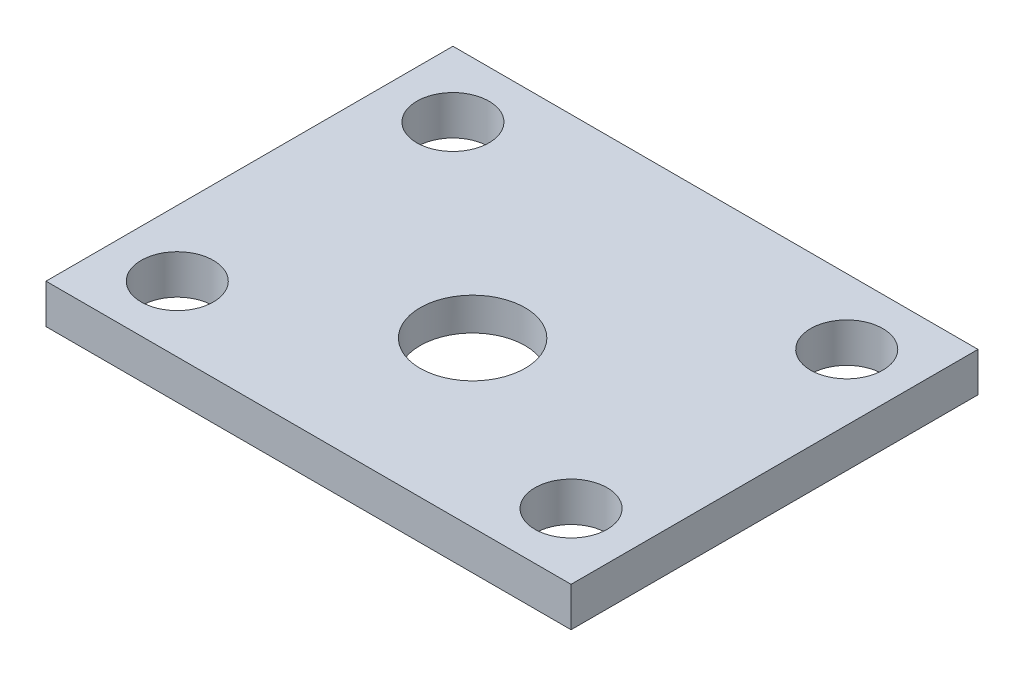
ISO-10303-21;
HEADER;
FILE_DESCRIPTION(('STEP AP214'),'2;1');
FILE_NAME('part.step','',(''),(''),'','','');
FILE_SCHEMA(('AUTOMOTIVE_DESIGN { 1 0 10303 214 1 1 1 1 }'));
ENDSEC;
DATA;
#1=APPLICATION_CONTEXT('core data for automotive mechanical design processes');
#2=APPLICATION_PROTOCOL_DEFINITION('international standard','automotive_design',2000,#1);
#3=PRODUCT_CONTEXT('',#1,'mechanical');
#4=PRODUCT('Part','Part','',(#3));
#5=PRODUCT_RELATED_PRODUCT_CATEGORY('part','',(#4));
#6=PRODUCT_DEFINITION_FORMATION('','',#4);
#7=PRODUCT_DEFINITION_CONTEXT('part definition',#1,'design');
#8=PRODUCT_DEFINITION('design','',#6,#7);
#9=PRODUCT_DEFINITION_SHAPE('','',#8);
#10=(LENGTH_UNIT() NAMED_UNIT(*) SI_UNIT(.MILLI.,.METRE.));
#11=(NAMED_UNIT(*) PLANE_ANGLE_UNIT() SI_UNIT($,.RADIAN.));
#12=(NAMED_UNIT(*) SI_UNIT($,.STERADIAN.) SOLID_ANGLE_UNIT());
#13=UNCERTAINTY_MEASURE_WITH_UNIT(LENGTH_MEASURE(1.E-05),#10,'distance_accuracy_value','');
#14=(GEOMETRIC_REPRESENTATION_CONTEXT(3) GLOBAL_UNCERTAINTY_ASSIGNED_CONTEXT((#13)) GLOBAL_UNIT_ASSIGNED_CONTEXT((#10,
#11,#12)) REPRESENTATION_CONTEXT('',''));
#15=CARTESIAN_POINT('',(0.,0.,0.));
#16=DIRECTION('',(0.,0.,1.));
#17=DIRECTION('',(1.,0.,0.));
#18=AXIS2_PLACEMENT_3D('',#15,#16,#17);
#19=CARTESIAN_POINT('',(20.,3.,15.5));
#20=DIRECTION('',(-1.,0.,0.));
#21=DIRECTION('',(0.,0.,1.));
#22=AXIS2_PLACEMENT_3D('',#19,#20,#21);
#23=PLANE('',#22);
#24=DIRECTION('',(0.,0.,-1.));
#25=VECTOR('',#24,1.);
#26=CARTESIAN_POINT('',(20.,0.,15.5));
#27=LINE('',#26,#25);
#28=CARTESIAN_POINT('',(20.,0.,15.5));
#29=VERTEX_POINT('',#28);
#30=CARTESIAN_POINT('',(20.,0.,-15.5));
#31=VERTEX_POINT('',#30);
#32=EDGE_CURVE('E95',#29,#31,#27,.T.);
#33=ORIENTED_EDGE('',*,*,#32,.T.);
#34=DIRECTION('',(0.,-1.,0.));
#35=VECTOR('',#34,1.);
#36=CARTESIAN_POINT('',(20.,3.,-15.5));
#37=LINE('',#36,#35);
#38=CARTESIAN_POINT('',(20.,3.,-15.5));
#39=VERTEX_POINT('',#38);
#40=EDGE_CURVE('E11',#39,#31,#37,.T.);
#41=ORIENTED_EDGE('',*,*,#40,.F.);
#42=DIRECTION('',(0.,0.,-1.));
#43=VECTOR('',#42,1.);
#44=CARTESIAN_POINT('',(20.,3.,15.5));
#45=LINE('',#44,#43);
#46=CARTESIAN_POINT('',(20.,3.,15.5));
#47=VERTEX_POINT('',#46);
#48=EDGE_CURVE('E83',#47,#39,#45,.T.);
#49=ORIENTED_EDGE('',*,*,#48,.F.);
#50=DIRECTION('',(0.,-1.,0.));
#51=VECTOR('',#50,1.);
#52=CARTESIAN_POINT('',(20.,3.,15.5));
#53=LINE('',#52,#51);
#54=EDGE_CURVE('E91',#47,#29,#53,.T.);
#55=ORIENTED_EDGE('',*,*,#54,.T.);
#56=EDGE_LOOP('',(#33,#41,#49,#55));
#57=FACE_BOUND('',#56,.T.);
#58=ADVANCED_FACE('F32',(#57),#23,.F.);
#59=CARTESIAN_POINT('',(-20.,3.,-15.5));
#60=DIRECTION('',(0.,0.,1.));
#61=DIRECTION('',(1.,0.,0.));
#62=AXIS2_PLACEMENT_3D('',#59,#60,#61);
#63=PLANE('',#62);
#64=DIRECTION('',(-1.,0.,0.));
#65=VECTOR('',#64,1.);
#66=CARTESIAN_POINT('',(-20.,0.,-15.5));
#67=LINE('',#66,#65);
#68=CARTESIAN_POINT('',(-20.,0.,-15.5));
#69=VERTEX_POINT('',#68);
#70=EDGE_CURVE('E87',#31,#69,#67,.T.);
#71=ORIENTED_EDGE('',*,*,#70,.T.);
#72=DIRECTION('',(0.,-1.,0.));
#73=VECTOR('',#72,1.);
#74=CARTESIAN_POINT('',(-20.,3.,-15.5));
#75=LINE('',#74,#73);
#76=CARTESIAN_POINT('',(-20.,3.,-15.5));
#77=VERTEX_POINT('',#76);
#78=EDGE_CURVE('E40',#77,#69,#75,.T.);
#79=ORIENTED_EDGE('',*,*,#78,.F.);
#80=DIRECTION('',(-1.,0.,0.));
#81=VECTOR('',#80,1.);
#82=CARTESIAN_POINT('',(-20.,3.,-15.5));
#83=LINE('',#82,#81);
#84=EDGE_CURVE('E78',#39,#77,#83,.T.);
#85=ORIENTED_EDGE('',*,*,#84,.F.);
#86=ORIENTED_EDGE('',*,*,#40,.T.);
#87=EDGE_LOOP('',(#71,#79,#85,#86));
#88=FACE_BOUND('',#87,.T.);
#89=ADVANCED_FACE('F86',(#88),#63,.F.);
#90=CARTESIAN_POINT('',(-20.,3.,15.5));
#91=DIRECTION('',(1.,0.,0.));
#92=DIRECTION('',(0.,0.,-1.));
#93=AXIS2_PLACEMENT_3D('',#90,#91,#92);
#94=PLANE('',#93);
#95=DIRECTION('',(0.,0.,1.));
#96=VECTOR('',#95,1.);
#97=CARTESIAN_POINT('',(-20.,0.,15.5));
#98=LINE('',#97,#96);
#99=CARTESIAN_POINT('',(-20.,0.,15.5));
#100=VERTEX_POINT('',#99);
#101=EDGE_CURVE('E65',#69,#100,#98,.T.);
#102=ORIENTED_EDGE('',*,*,#101,.T.);
#103=DIRECTION('',(0.,-1.,0.));
#104=VECTOR('',#103,1.);
#105=CARTESIAN_POINT('',(-20.,3.,15.5));
#106=LINE('',#105,#104);
#107=CARTESIAN_POINT('',(-20.,3.,15.5));
#108=VERTEX_POINT('',#107);
#109=EDGE_CURVE('E88',#108,#100,#106,.T.);
#110=ORIENTED_EDGE('',*,*,#109,.F.);
#111=DIRECTION('',(0.,0.,1.));
#112=VECTOR('',#111,1.);
#113=CARTESIAN_POINT('',(-20.,3.,15.5));
#114=LINE('',#113,#112);
#115=EDGE_CURVE('E81',#77,#108,#114,.T.);
#116=ORIENTED_EDGE('',*,*,#115,.F.);
#117=ORIENTED_EDGE('',*,*,#78,.T.);
#118=EDGE_LOOP('',(#102,#110,#116,#117));
#119=FACE_BOUND('',#118,.T.);
#120=ADVANCED_FACE('F89',(#119),#94,.F.);
#121=CARTESIAN_POINT('',(-20.,3.,15.5));
#122=DIRECTION('',(0.,0.,-1.));
#123=DIRECTION('',(-1.,0.,0.));
#124=AXIS2_PLACEMENT_3D('',#121,#122,#123);
#125=PLANE('',#124);
#126=DIRECTION('',(1.,0.,0.));
#127=VECTOR('',#126,1.);
#128=CARTESIAN_POINT('',(-20.,0.,15.5));
#129=LINE('',#128,#127);
#130=EDGE_CURVE('E71',#100,#29,#129,.T.);
#131=ORIENTED_EDGE('',*,*,#130,.T.);
#132=ORIENTED_EDGE('',*,*,#54,.F.);
#133=DIRECTION('',(1.,0.,0.));
#134=VECTOR('',#133,1.);
#135=CARTESIAN_POINT('',(-20.,3.,15.5));
#136=LINE('',#135,#134);
#137=EDGE_CURVE('E48',#108,#47,#136,.T.);
#138=ORIENTED_EDGE('',*,*,#137,.F.);
#139=ORIENTED_EDGE('',*,*,#109,.T.);
#140=EDGE_LOOP('',(#131,#132,#138,#139));
#141=FACE_BOUND('',#140,.T.);
#142=ADVANCED_FACE('F103',(#141),#125,.F.);
#143=CARTESIAN_POINT('',(0.,3.,0.));
#144=DIRECTION('',(0.,-1.,0.));
#145=DIRECTION('',(0.,0.,-1.));
#146=AXIS2_PLACEMENT_3D('',#143,#144,#145);
#147=PLANE('',#146);
#148=CARTESIAN_POINT('',(0.,3.,3.));
#149=DIRECTION('',(0.,1.,0.));
#150=DIRECTION('',(0.,0.,1.));
#151=AXIS2_PLACEMENT_3D('',#148,#149,#150);
#152=CIRCLE('',#151,4.);
#153=CARTESIAN_POINT('',(0.,3.,7.));
#154=VERTEX_POINT('',#153);
#155=EDGE_CURVE('E141',#154,#154,#152,.T.);
#156=ORIENTED_EDGE('',*,*,#155,.F.);
#157=EDGE_LOOP('',(#156));
#158=FACE_BOUND('',#157,.T.);
#159=CARTESIAN_POINT('',(-14.9999999999998,3.,10.5));
#160=DIRECTION('',(0.,1.,0.));
#161=DIRECTION('',(0.,0.,1.));
#162=AXIS2_PLACEMENT_3D('',#159,#160,#161);
#163=CIRCLE('',#162,2.75);
#164=CARTESIAN_POINT('',(-14.9999999999998,3.,13.25));
#165=VERTEX_POINT('',#164);
#166=EDGE_CURVE('E119',#165,#165,#163,.T.);
#167=ORIENTED_EDGE('',*,*,#166,.F.);
#168=EDGE_LOOP('',(#167));
#169=FACE_BOUND('',#168,.T.);
#170=CARTESIAN_POINT('',(15.0000000000002,3.,10.5));
#171=DIRECTION('',(0.,1.,0.));
#172=DIRECTION('',(0.,0.,1.));
#173=AXIS2_PLACEMENT_3D('',#170,#171,#172);
#174=CIRCLE('',#173,2.75);
#175=CARTESIAN_POINT('',(15.0000000000002,3.,13.25));
#176=VERTEX_POINT('',#175);
#177=EDGE_CURVE('E118',#176,#176,#174,.T.);
#178=ORIENTED_EDGE('',*,*,#177,.F.);
#179=EDGE_LOOP('',(#178));
#180=FACE_BOUND('',#179,.T.);
#181=CARTESIAN_POINT('',(15.,3.,-10.5));
#182=DIRECTION('',(0.,1.,0.));
#183=DIRECTION('',(0.,0.,1.));
#184=AXIS2_PLACEMENT_3D('',#181,#182,#183);
#185=CIRCLE('',#184,2.75);
#186=CARTESIAN_POINT('',(15.,3.,-7.75));
#187=VERTEX_POINT('',#186);
#188=EDGE_CURVE('E126',#187,#187,#185,.T.);
#189=ORIENTED_EDGE('',*,*,#188,.F.);
#190=EDGE_LOOP('',(#189));
#191=FACE_BOUND('',#190,.T.);
#192=CARTESIAN_POINT('',(-15.,3.,-10.5));
#193=DIRECTION('',(0.,1.,0.));
#194=DIRECTION('',(0.,0.,1.));
#195=AXIS2_PLACEMENT_3D('',#192,#193,#194);
#196=CIRCLE('',#195,2.75);
#197=CARTESIAN_POINT('',(-15.,3.,-7.75));
#198=VERTEX_POINT('',#197);
#199=EDGE_CURVE('E111',#198,#198,#196,.T.);
#200=ORIENTED_EDGE('',*,*,#199,.F.);
#201=EDGE_LOOP('',(#200));
#202=FACE_BOUND('',#201,.T.);
#203=ORIENTED_EDGE('',*,*,#48,.T.);
#204=ORIENTED_EDGE('',*,*,#84,.T.);
#205=ORIENTED_EDGE('',*,*,#115,.T.);
#206=ORIENTED_EDGE('',*,*,#137,.T.);
#207=EDGE_LOOP('',(#203,#204,#205,#206));
#208=FACE_BOUND('',#207,.T.);
#209=ADVANCED_FACE('F79',(#158,#169,#180,#191,#202,#208),#147,.F.);
#210=CARTESIAN_POINT('',(0.,0.,0.));
#211=DIRECTION('',(0.,-1.,0.));
#212=DIRECTION('',(0.,0.,-1.));
#213=AXIS2_PLACEMENT_3D('',#210,#211,#212);
#214=PLANE('',#213);
#215=CARTESIAN_POINT('',(0.,0.,3.));
#216=DIRECTION('',(0.,-1.,0.));
#217=DIRECTION('',(0.,0.,-1.));
#218=AXIS2_PLACEMENT_3D('',#215,#216,#217);
#219=CIRCLE('',#218,8.725);
#220=CARTESIAN_POINT('',(0.,0.,-5.725));
#221=VERTEX_POINT('',#220);
#222=EDGE_CURVE('E133',#221,#221,#219,.T.);
#223=ORIENTED_EDGE('',*,*,#222,.F.);
#224=EDGE_LOOP('',(#223));
#225=FACE_BOUND('',#224,.T.);
#226=CARTESIAN_POINT('',(-14.9999999999998,0.,10.5));
#227=DIRECTION('',(0.,-1.,0.));
#228=DIRECTION('',(0.,0.,-1.));
#229=AXIS2_PLACEMENT_3D('',#226,#227,#228);
#230=CIRCLE('',#229,2.75);
#231=CARTESIAN_POINT('',(-14.9999999999998,0.,13.25));
#232=VERTEX_POINT('',#231);
#233=EDGE_CURVE('E115',#232,#232,#230,.F.);
#234=ORIENTED_EDGE('',*,*,#233,.T.);
#235=EDGE_LOOP('',(#234));
#236=FACE_BOUND('',#235,.T.);
#237=CARTESIAN_POINT('',(15.0000000000002,0.,10.5));
#238=DIRECTION('',(0.,-1.,0.));
#239=DIRECTION('',(0.,0.,-1.));
#240=AXIS2_PLACEMENT_3D('',#237,#238,#239);
#241=CIRCLE('',#240,2.75);
#242=CARTESIAN_POINT('',(15.0000000000002,0.,13.25));
#243=VERTEX_POINT('',#242);
#244=EDGE_CURVE('E123',#243,#243,#241,.F.);
#245=ORIENTED_EDGE('',*,*,#244,.T.);
#246=EDGE_LOOP('',(#245));
#247=FACE_BOUND('',#246,.T.);
#248=CARTESIAN_POINT('',(15.,0.,-10.5));
#249=DIRECTION('',(0.,-1.,0.));
#250=DIRECTION('',(0.,0.,-1.));
#251=AXIS2_PLACEMENT_3D('',#248,#249,#250);
#252=CIRCLE('',#251,2.75);
#253=CARTESIAN_POINT('',(15.,0.,-7.75));
#254=VERTEX_POINT('',#253);
#255=EDGE_CURVE('E114',#254,#254,#252,.F.);
#256=ORIENTED_EDGE('',*,*,#255,.T.);
#257=EDGE_LOOP('',(#256));
#258=FACE_BOUND('',#257,.T.);
#259=CARTESIAN_POINT('',(-15.,0.,-10.5));
#260=DIRECTION('',(0.,-1.,0.));
#261=DIRECTION('',(0.,0.,-1.));
#262=AXIS2_PLACEMENT_3D('',#259,#260,#261);
#263=CIRCLE('',#262,2.75);
#264=CARTESIAN_POINT('',(-15.,0.,-7.75));
#265=VERTEX_POINT('',#264);
#266=EDGE_CURVE('E98',#265,#265,#263,.F.);
#267=ORIENTED_EDGE('',*,*,#266,.T.);
#268=EDGE_LOOP('',(#267));
#269=FACE_BOUND('',#268,.T.);
#270=ORIENTED_EDGE('',*,*,#32,.F.);
#271=ORIENTED_EDGE('',*,*,#130,.F.);
#272=ORIENTED_EDGE('',*,*,#101,.F.);
#273=ORIENTED_EDGE('',*,*,#70,.F.);
#274=EDGE_LOOP('',(#270,#271,#272,#273));
#275=FACE_BOUND('',#274,.T.);
#276=ADVANCED_FACE('F106',(#225,#236,#247,#258,#269,#275),#214,.T.);
#277=CARTESIAN_POINT('',(-15.,-7.77817459305202,-10.5));
#278=DIRECTION('',(0.,1.,0.));
#279=DIRECTION('',(0.,0.,1.));
#280=AXIS2_PLACEMENT_3D('',#277,#278,#279);
#281=CYLINDRICAL_SURFACE('',#280,2.75);
#282=CARTESIAN_POINT('',(-15.,3.,-7.75));
#283=CARTESIAN_POINT('',(-15.,2.96875,-7.75));
#284=CARTESIAN_POINT('',(-15.,2.9375,-7.75));
#285=CARTESIAN_POINT('',(-15.,2.875,-7.75));
#286=CARTESIAN_POINT('',(-15.,2.84375,-7.75));
#287=CARTESIAN_POINT('',(-15.,2.78125,-7.75));
#288=CARTESIAN_POINT('',(-15.,2.75,-7.75));
#289=CARTESIAN_POINT('',(-15.,2.6875,-7.75));
#290=CARTESIAN_POINT('',(-15.,2.65625,-7.75));
#291=CARTESIAN_POINT('',(-15.,2.59375,-7.75));
#292=CARTESIAN_POINT('',(-15.,2.5625,-7.75));
#293=CARTESIAN_POINT('',(-15.,2.5,-7.75));
#294=CARTESIAN_POINT('',(-15.,2.46875,-7.75));
#295=CARTESIAN_POINT('',(-15.,2.40625,-7.75));
#296=CARTESIAN_POINT('',(-15.,2.375,-7.75));
#297=CARTESIAN_POINT('',(-15.,2.3125,-7.75));
#298=CARTESIAN_POINT('',(-15.,2.28125,-7.75));
#299=CARTESIAN_POINT('',(-15.,2.21875,-7.75));
#300=CARTESIAN_POINT('',(-15.,2.1875,-7.75));
#301=CARTESIAN_POINT('',(-15.,2.125,-7.75));
#302=CARTESIAN_POINT('',(-15.,2.09375,-7.75));
#303=CARTESIAN_POINT('',(-15.,2.03125,-7.75));
#304=CARTESIAN_POINT('',(-15.,2.,-7.75));
#305=CARTESIAN_POINT('',(-15.,1.9375,-7.75));
#306=CARTESIAN_POINT('',(-15.,1.90625,-7.75));
#307=CARTESIAN_POINT('',(-15.,1.84375,-7.75));
#308=CARTESIAN_POINT('',(-15.,1.8125,-7.75));
#309=CARTESIAN_POINT('',(-15.,1.75,-7.75));
#310=CARTESIAN_POINT('',(-15.,1.71875,-7.75));
#311=CARTESIAN_POINT('',(-15.,1.65625,-7.75));
#312=CARTESIAN_POINT('',(-15.,1.625,-7.75));
#313=CARTESIAN_POINT('',(-15.,1.5625,-7.75));
#314=CARTESIAN_POINT('',(-15.,1.53125,-7.75));
#315=CARTESIAN_POINT('',(-15.,1.46875,-7.75));
#316=CARTESIAN_POINT('',(-15.,1.4375,-7.75));
#317=CARTESIAN_POINT('',(-15.,1.375,-7.75));
#318=CARTESIAN_POINT('',(-15.,1.34375,-7.75));
#319=CARTESIAN_POINT('',(-15.,1.28125,-7.75));
#320=CARTESIAN_POINT('',(-15.,1.25,-7.75));
#321=CARTESIAN_POINT('',(-15.,1.1875,-7.75));
#322=CARTESIAN_POINT('',(-15.,1.15625,-7.75));
#323=CARTESIAN_POINT('',(-15.,1.09375,-7.75));
#324=CARTESIAN_POINT('',(-15.,1.0625,-7.75));
#325=CARTESIAN_POINT('',(-15.,0.999999999999999,-7.75));
#326=CARTESIAN_POINT('',(-15.,0.968749999999999,-7.75));
#327=CARTESIAN_POINT('',(-15.,0.90625,-7.75));
#328=CARTESIAN_POINT('',(-15.,0.875,-7.75));
#329=CARTESIAN_POINT('',(-15.,0.8125,-7.75));
#330=CARTESIAN_POINT('',(-15.,0.78125,-7.75));
#331=CARTESIAN_POINT('',(-15.,0.71875,-7.75));
#332=CARTESIAN_POINT('',(-15.,0.6875,-7.75));
#333=CARTESIAN_POINT('',(-15.,0.625,-7.75));
#334=CARTESIAN_POINT('',(-15.,0.59375,-7.75));
#335=CARTESIAN_POINT('',(-15.,0.53125,-7.75));
#336=CARTESIAN_POINT('',(-15.,0.5,-7.75));
#337=CARTESIAN_POINT('',(-15.,0.4375,-7.75));
#338=CARTESIAN_POINT('',(-15.,0.40625,-7.75));
#339=CARTESIAN_POINT('',(-15.,0.343749999999999,-7.75));
#340=CARTESIAN_POINT('',(-15.,0.312499999999999,-7.75));
#341=CARTESIAN_POINT('',(-15.,0.249999999999999,-7.75));
#342=CARTESIAN_POINT('',(-15.,0.218749999999999,-7.75));
#343=CARTESIAN_POINT('',(-15.,0.156249999999999,-7.75));
#344=CARTESIAN_POINT('',(-15.,0.124999999999999,-7.75));
#345=CARTESIAN_POINT('',(-15.,0.0624999999999995,-7.75));
#346=CARTESIAN_POINT('',(-15.,0.0312499999999997,-7.75));
#347=CARTESIAN_POINT('',(-15.,0.,-7.75));
#348=B_SPLINE_CURVE_WITH_KNOTS('',3,(#282,#283,#284,#285,#286,#287,#288,#289,#290,#291,#292,
#293,#294,#295,#296,#297,#298,#299,#300,#301,#302,#303,#304,#305,#306,#307,#308,#309,#310,#311,
#312,#313,#314,#315,#316,#317,#318,#319,#320,#321,#322,#323,#324,#325,#326,#327,#328,#329,#330,
#331,#332,#333,#334,#335,#336,#337,#338,#339,#340,#341,#342,#343,#344,#345,#346,#347),
.UNSPECIFIED.,.F.,.F.,(4,2,2,2,2,2,2,2,2,2,2,2,2,2,2,2,2,2,2,2,2,2,2,2,2,2,2,2,2,2,2,2,4),(0.,
0.0937500000000001,0.1875,0.28125,0.375,0.46875,0.5625,0.656250000000001,0.750000000000001,
0.843749999999999,0.937499999999999,1.03125,1.125,1.21875,1.3125,1.40625,1.5,1.59375,1.6875,
1.78125,1.875,1.96875,2.0625,2.15625,2.25,2.34375,2.4375,2.53125,2.625,2.71875,2.8125,2.90625,
3.),.UNSPECIFIED.);
#349=EDGE_CURVE('BSEAM159',#198,#265,#348,.T.);
#350=ORIENTED_EDGE('',*,*,#199,.T.);
#351=ORIENTED_EDGE('',*,*,#266,.F.);
#352=ORIENTED_EDGE('',*,*,#349,.T.);
#353=ORIENTED_EDGE('',*,*,#349,.F.);
#354=EDGE_LOOP('',(#350,#352,#351,#353));
#355=FACE_BOUND('',#354,.T.);
#356=ADVANCED_FACE('F159',(#355),#281,.F.);
#357=CARTESIAN_POINT('',(15.,-7.77817459305202,-10.5));
#358=DIRECTION('',(0.,1.,0.));
#359=DIRECTION('',(0.,0.,1.));
#360=AXIS2_PLACEMENT_3D('',#357,#358,#359);
#361=CYLINDRICAL_SURFACE('',#360,2.75);
#362=CARTESIAN_POINT('',(15.,3.,-7.75));
#363=CARTESIAN_POINT('',(15.,2.96875,-7.75));
#364=CARTESIAN_POINT('',(15.,2.9375,-7.75));
#365=CARTESIAN_POINT('',(15.,2.875,-7.75));
#366=CARTESIAN_POINT('',(15.,2.84375,-7.75));
#367=CARTESIAN_POINT('',(15.,2.78125,-7.75));
#368=CARTESIAN_POINT('',(15.,2.75,-7.75));
#369=CARTESIAN_POINT('',(15.,2.6875,-7.75));
#370=CARTESIAN_POINT('',(15.,2.65625,-7.75));
#371=CARTESIAN_POINT('',(15.,2.59375,-7.75));
#372=CARTESIAN_POINT('',(15.,2.5625,-7.75));
#373=CARTESIAN_POINT('',(15.,2.5,-7.75));
#374=CARTESIAN_POINT('',(15.,2.46875,-7.75));
#375=CARTESIAN_POINT('',(15.,2.40625,-7.75));
#376=CARTESIAN_POINT('',(15.,2.375,-7.75));
#377=CARTESIAN_POINT('',(15.,2.3125,-7.75));
#378=CARTESIAN_POINT('',(15.,2.28125,-7.75));
#379=CARTESIAN_POINT('',(15.,2.21875,-7.75));
#380=CARTESIAN_POINT('',(15.,2.1875,-7.75));
#381=CARTESIAN_POINT('',(15.,2.125,-7.75));
#382=CARTESIAN_POINT('',(15.,2.09375,-7.75));
#383=CARTESIAN_POINT('',(15.,2.03125,-7.75));
#384=CARTESIAN_POINT('',(15.,2.,-7.75));
#385=CARTESIAN_POINT('',(15.,1.9375,-7.75));
#386=CARTESIAN_POINT('',(15.,1.90625,-7.75));
#387=CARTESIAN_POINT('',(15.,1.84375,-7.75));
#388=CARTESIAN_POINT('',(15.,1.8125,-7.75));
#389=CARTESIAN_POINT('',(15.,1.75,-7.75));
#390=CARTESIAN_POINT('',(15.,1.71875,-7.75));
#391=CARTESIAN_POINT('',(15.,1.65625,-7.75));
#392=CARTESIAN_POINT('',(15.,1.625,-7.75));
#393=CARTESIAN_POINT('',(15.,1.5625,-7.75));
#394=CARTESIAN_POINT('',(15.,1.53125,-7.75));
#395=CARTESIAN_POINT('',(15.,1.46875,-7.75));
#396=CARTESIAN_POINT('',(15.,1.4375,-7.75));
#397=CARTESIAN_POINT('',(15.,1.375,-7.75));
#398=CARTESIAN_POINT('',(15.,1.34375,-7.75));
#399=CARTESIAN_POINT('',(15.,1.28125,-7.75));
#400=CARTESIAN_POINT('',(15.,1.25,-7.75));
#401=CARTESIAN_POINT('',(15.,1.1875,-7.75));
#402=CARTESIAN_POINT('',(15.,1.15625,-7.75));
#403=CARTESIAN_POINT('',(15.,1.09375,-7.75));
#404=CARTESIAN_POINT('',(15.,1.0625,-7.75));
#405=CARTESIAN_POINT('',(15.,0.999999999999999,-7.75));
#406=CARTESIAN_POINT('',(15.,0.968749999999999,-7.75));
#407=CARTESIAN_POINT('',(15.,0.90625,-7.75));
#408=CARTESIAN_POINT('',(15.,0.875,-7.75));
#409=CARTESIAN_POINT('',(15.,0.8125,-7.75));
#410=CARTESIAN_POINT('',(15.,0.78125,-7.75));
#411=CARTESIAN_POINT('',(15.,0.71875,-7.75));
#412=CARTESIAN_POINT('',(15.,0.6875,-7.75));
#413=CARTESIAN_POINT('',(15.,0.625,-7.75));
#414=CARTESIAN_POINT('',(15.,0.59375,-7.75));
#415=CARTESIAN_POINT('',(15.,0.53125,-7.75));
#416=CARTESIAN_POINT('',(15.,0.5,-7.75));
#417=CARTESIAN_POINT('',(15.,0.4375,-7.75));
#418=CARTESIAN_POINT('',(15.,0.40625,-7.75));
#419=CARTESIAN_POINT('',(15.,0.343749999999999,-7.75));
#420=CARTESIAN_POINT('',(15.,0.312499999999999,-7.75));
#421=CARTESIAN_POINT('',(15.,0.249999999999999,-7.75));
#422=CARTESIAN_POINT('',(15.,0.218749999999999,-7.75));
#423=CARTESIAN_POINT('',(15.,0.156249999999999,-7.75));
#424=CARTESIAN_POINT('',(15.,0.124999999999999,-7.75));
#425=CARTESIAN_POINT('',(15.,0.0624999999999995,-7.75));
#426=CARTESIAN_POINT('',(15.,0.0312499999999997,-7.75));
#427=CARTESIAN_POINT('',(15.,0.,-7.75));
#428=B_SPLINE_CURVE_WITH_KNOTS('',3,(#362,#363,#364,#365,#366,#367,#368,#369,#370,#371,#372,
#373,#374,#375,#376,#377,#378,#379,#380,#381,#382,#383,#384,#385,#386,#387,#388,#389,#390,#391,
#392,#393,#394,#395,#396,#397,#398,#399,#400,#401,#402,#403,#404,#405,#406,#407,#408,#409,#410,
#411,#412,#413,#414,#415,#416,#417,#418,#419,#420,#421,#422,#423,#424,#425,#426,#427),
.UNSPECIFIED.,.F.,.F.,(4,2,2,2,2,2,2,2,2,2,2,2,2,2,2,2,2,2,2,2,2,2,2,2,2,2,2,2,2,2,2,2,4),(0.,
0.0937500000000001,0.1875,0.28125,0.375,0.46875,0.5625,0.656250000000001,0.750000000000001,
0.843749999999999,0.937499999999999,1.03125,1.125,1.21875,1.3125,1.40625,1.5,1.59375,1.6875,
1.78125,1.875,1.96875,2.0625,2.15625,2.25,2.34375,2.4375,2.53125,2.625,2.71875,2.8125,2.90625,
3.),.UNSPECIFIED.);
#429=EDGE_CURVE('BSEAM162',#187,#254,#428,.T.);
#430=ORIENTED_EDGE('',*,*,#188,.T.);
#431=ORIENTED_EDGE('',*,*,#255,.F.);
#432=ORIENTED_EDGE('',*,*,#429,.T.);
#433=ORIENTED_EDGE('',*,*,#429,.F.);
#434=EDGE_LOOP('',(#430,#432,#431,#433));
#435=FACE_BOUND('',#434,.T.);
#436=ADVANCED_FACE('F162',(#435),#361,.F.);
#437=CARTESIAN_POINT('',(15.0000000000002,-7.77817459305202,10.5));
#438=DIRECTION('',(0.,1.,0.));
#439=DIRECTION('',(0.,0.,1.));
#440=AXIS2_PLACEMENT_3D('',#437,#438,#439);
#441=CYLINDRICAL_SURFACE('',#440,2.75);
#442=CARTESIAN_POINT('',(15.0000000000002,3.,13.25));
#443=CARTESIAN_POINT('',(15.0000000000002,2.96875,13.25));
#444=CARTESIAN_POINT('',(15.0000000000002,2.9375,13.25));
#445=CARTESIAN_POINT('',(15.0000000000002,2.875,13.25));
#446=CARTESIAN_POINT('',(15.0000000000002,2.84375,13.25));
#447=CARTESIAN_POINT('',(15.0000000000002,2.78125,13.25));
#448=CARTESIAN_POINT('',(15.0000000000002,2.75,13.25));
#449=CARTESIAN_POINT('',(15.0000000000002,2.6875,13.25));
#450=CARTESIAN_POINT('',(15.0000000000002,2.65625,13.25));
#451=CARTESIAN_POINT('',(15.0000000000002,2.59375,13.25));
#452=CARTESIAN_POINT('',(15.0000000000002,2.5625,13.25));
#453=CARTESIAN_POINT('',(15.0000000000002,2.5,13.25));
#454=CARTESIAN_POINT('',(15.0000000000002,2.46875,13.25));
#455=CARTESIAN_POINT('',(15.0000000000002,2.40625,13.25));
#456=CARTESIAN_POINT('',(15.0000000000002,2.375,13.25));
#457=CARTESIAN_POINT('',(15.0000000000002,2.3125,13.25));
#458=CARTESIAN_POINT('',(15.0000000000002,2.28125,13.25));
#459=CARTESIAN_POINT('',(15.0000000000002,2.21875,13.25));
#460=CARTESIAN_POINT('',(15.0000000000002,2.1875,13.25));
#461=CARTESIAN_POINT('',(15.0000000000002,2.125,13.25));
#462=CARTESIAN_POINT('',(15.0000000000002,2.09375,13.25));
#463=CARTESIAN_POINT('',(15.0000000000002,2.03125,13.25));
#464=CARTESIAN_POINT('',(15.0000000000002,2.,13.25));
#465=CARTESIAN_POINT('',(15.0000000000002,1.9375,13.25));
#466=CARTESIAN_POINT('',(15.0000000000002,1.90625,13.25));
#467=CARTESIAN_POINT('',(15.0000000000002,1.84375,13.25));
#468=CARTESIAN_POINT('',(15.0000000000002,1.8125,13.25));
#469=CARTESIAN_POINT('',(15.0000000000002,1.75,13.25));
#470=CARTESIAN_POINT('',(15.0000000000002,1.71875,13.25));
#471=CARTESIAN_POINT('',(15.0000000000002,1.65625,13.25));
#472=CARTESIAN_POINT('',(15.0000000000002,1.625,13.25));
#473=CARTESIAN_POINT('',(15.0000000000002,1.5625,13.25));
#474=CARTESIAN_POINT('',(15.0000000000002,1.53125,13.25));
#475=CARTESIAN_POINT('',(15.0000000000002,1.46875,13.25));
#476=CARTESIAN_POINT('',(15.0000000000002,1.4375,13.25));
#477=CARTESIAN_POINT('',(15.0000000000002,1.375,13.25));
#478=CARTESIAN_POINT('',(15.0000000000002,1.34375,13.25));
#479=CARTESIAN_POINT('',(15.0000000000002,1.28125,13.25));
#480=CARTESIAN_POINT('',(15.0000000000002,1.25,13.25));
#481=CARTESIAN_POINT('',(15.0000000000002,1.1875,13.25));
#482=CARTESIAN_POINT('',(15.0000000000002,1.15625,13.25));
#483=CARTESIAN_POINT('',(15.0000000000002,1.09375,13.25));
#484=CARTESIAN_POINT('',(15.0000000000002,1.0625,13.25));
#485=CARTESIAN_POINT('',(15.0000000000002,0.999999999999999,13.25));
#486=CARTESIAN_POINT('',(15.0000000000002,0.968749999999999,13.25));
#487=CARTESIAN_POINT('',(15.0000000000002,0.90625,13.25));
#488=CARTESIAN_POINT('',(15.0000000000002,0.875,13.25));
#489=CARTESIAN_POINT('',(15.0000000000002,0.8125,13.25));
#490=CARTESIAN_POINT('',(15.0000000000002,0.78125,13.25));
#491=CARTESIAN_POINT('',(15.0000000000002,0.71875,13.25));
#492=CARTESIAN_POINT('',(15.0000000000002,0.6875,13.25));
#493=CARTESIAN_POINT('',(15.0000000000002,0.625,13.25));
#494=CARTESIAN_POINT('',(15.0000000000002,0.59375,13.25));
#495=CARTESIAN_POINT('',(15.0000000000002,0.53125,13.25));
#496=CARTESIAN_POINT('',(15.0000000000002,0.5,13.25));
#497=CARTESIAN_POINT('',(15.0000000000002,0.4375,13.25));
#498=CARTESIAN_POINT('',(15.0000000000002,0.40625,13.25));
#499=CARTESIAN_POINT('',(15.0000000000002,0.343749999999999,13.25));
#500=CARTESIAN_POINT('',(15.0000000000002,0.312499999999999,13.25));
#501=CARTESIAN_POINT('',(15.0000000000002,0.249999999999999,13.25));
#502=CARTESIAN_POINT('',(15.0000000000002,0.218749999999999,13.25));
#503=CARTESIAN_POINT('',(15.0000000000002,0.156249999999999,13.25));
#504=CARTESIAN_POINT('',(15.0000000000002,0.124999999999999,13.25));
#505=CARTESIAN_POINT('',(15.0000000000002,0.0624999999999995,13.25));
#506=CARTESIAN_POINT('',(15.0000000000002,0.0312499999999997,13.25));
#507=CARTESIAN_POINT('',(15.0000000000002,0.,13.25));
#508=B_SPLINE_CURVE_WITH_KNOTS('',3,(#442,#443,#444,#445,#446,#447,#448,#449,#450,#451,#452,
#453,#454,#455,#456,#457,#458,#459,#460,#461,#462,#463,#464,#465,#466,#467,#468,#469,#470,#471,
#472,#473,#474,#475,#476,#477,#478,#479,#480,#481,#482,#483,#484,#485,#486,#487,#488,#489,#490,
#491,#492,#493,#494,#495,#496,#497,#498,#499,#500,#501,#502,#503,#504,#505,#506,#507),
.UNSPECIFIED.,.F.,.F.,(4,2,2,2,2,2,2,2,2,2,2,2,2,2,2,2,2,2,2,2,2,2,2,2,2,2,2,2,2,2,2,2,4),(0.,
0.0937500000000001,0.1875,0.28125,0.375,0.46875,0.5625,0.656250000000001,0.750000000000001,
0.843749999999999,0.937499999999999,1.03125,1.125,1.21875,1.3125,1.40625,1.5,1.59375,1.6875,
1.78125,1.875,1.96875,2.0625,2.15625,2.25,2.34375,2.4375,2.53125,2.625,2.71875,2.8125,2.90625,
3.),.UNSPECIFIED.);
#509=EDGE_CURVE('BSEAM226',#176,#243,#508,.T.);
#510=ORIENTED_EDGE('',*,*,#177,.T.);
#511=ORIENTED_EDGE('',*,*,#244,.F.);
#512=ORIENTED_EDGE('',*,*,#509,.T.);
#513=ORIENTED_EDGE('',*,*,#509,.F.);
#514=EDGE_LOOP('',(#510,#512,#511,#513));
#515=FACE_BOUND('',#514,.T.);
#516=ADVANCED_FACE('F226',(#515),#441,.F.);
#517=CARTESIAN_POINT('',(-14.9999999999998,-7.77817459305202,10.5));
#518=DIRECTION('',(0.,1.,0.));
#519=DIRECTION('',(0.,0.,1.));
#520=AXIS2_PLACEMENT_3D('',#517,#518,#519);
#521=CYLINDRICAL_SURFACE('',#520,2.75);
#522=CARTESIAN_POINT('',(-14.9999999999998,3.,13.25));
#523=CARTESIAN_POINT('',(-14.9999999999998,2.96875,13.25));
#524=CARTESIAN_POINT('',(-14.9999999999998,2.9375,13.25));
#525=CARTESIAN_POINT('',(-14.9999999999998,2.875,13.25));
#526=CARTESIAN_POINT('',(-14.9999999999998,2.84375,13.25));
#527=CARTESIAN_POINT('',(-14.9999999999998,2.78125,13.25));
#528=CARTESIAN_POINT('',(-14.9999999999998,2.75,13.25));
#529=CARTESIAN_POINT('',(-14.9999999999998,2.6875,13.25));
#530=CARTESIAN_POINT('',(-14.9999999999998,2.65625,13.25));
#531=CARTESIAN_POINT('',(-14.9999999999998,2.59375,13.25));
#532=CARTESIAN_POINT('',(-14.9999999999998,2.5625,13.25));
#533=CARTESIAN_POINT('',(-14.9999999999998,2.5,13.25));
#534=CARTESIAN_POINT('',(-14.9999999999998,2.46875,13.25));
#535=CARTESIAN_POINT('',(-14.9999999999998,2.40625,13.25));
#536=CARTESIAN_POINT('',(-14.9999999999998,2.375,13.25));
#537=CARTESIAN_POINT('',(-14.9999999999998,2.3125,13.25));
#538=CARTESIAN_POINT('',(-14.9999999999998,2.28125,13.25));
#539=CARTESIAN_POINT('',(-14.9999999999998,2.21875,13.25));
#540=CARTESIAN_POINT('',(-14.9999999999998,2.1875,13.25));
#541=CARTESIAN_POINT('',(-14.9999999999998,2.125,13.25));
#542=CARTESIAN_POINT('',(-14.9999999999998,2.09375,13.25));
#543=CARTESIAN_POINT('',(-14.9999999999998,2.03125,13.25));
#544=CARTESIAN_POINT('',(-14.9999999999998,2.,13.25));
#545=CARTESIAN_POINT('',(-14.9999999999998,1.9375,13.25));
#546=CARTESIAN_POINT('',(-14.9999999999998,1.90625,13.25));
#547=CARTESIAN_POINT('',(-14.9999999999998,1.84375,13.25));
#548=CARTESIAN_POINT('',(-14.9999999999998,1.8125,13.25));
#549=CARTESIAN_POINT('',(-14.9999999999998,1.75,13.25));
#550=CARTESIAN_POINT('',(-14.9999999999998,1.71875,13.25));
#551=CARTESIAN_POINT('',(-14.9999999999998,1.65625,13.25));
#552=CARTESIAN_POINT('',(-14.9999999999998,1.625,13.25));
#553=CARTESIAN_POINT('',(-14.9999999999998,1.5625,13.25));
#554=CARTESIAN_POINT('',(-14.9999999999998,1.53125,13.25));
#555=CARTESIAN_POINT('',(-14.9999999999998,1.46875,13.25));
#556=CARTESIAN_POINT('',(-14.9999999999998,1.4375,13.25));
#557=CARTESIAN_POINT('',(-14.9999999999998,1.375,13.25));
#558=CARTESIAN_POINT('',(-14.9999999999998,1.34375,13.25));
#559=CARTESIAN_POINT('',(-14.9999999999998,1.28125,13.25));
#560=CARTESIAN_POINT('',(-14.9999999999998,1.25,13.25));
#561=CARTESIAN_POINT('',(-14.9999999999998,1.1875,13.25));
#562=CARTESIAN_POINT('',(-14.9999999999998,1.15625,13.25));
#563=CARTESIAN_POINT('',(-14.9999999999998,1.09375,13.25));
#564=CARTESIAN_POINT('',(-14.9999999999998,1.0625,13.25));
#565=CARTESIAN_POINT('',(-14.9999999999998,0.999999999999999,13.25));
#566=CARTESIAN_POINT('',(-14.9999999999998,0.968749999999999,13.25));
#567=CARTESIAN_POINT('',(-14.9999999999998,0.90625,13.25));
#568=CARTESIAN_POINT('',(-14.9999999999998,0.875,13.25));
#569=CARTESIAN_POINT('',(-14.9999999999998,0.8125,13.25));
#570=CARTESIAN_POINT('',(-14.9999999999998,0.78125,13.25));
#571=CARTESIAN_POINT('',(-14.9999999999998,0.71875,13.25));
#572=CARTESIAN_POINT('',(-14.9999999999998,0.6875,13.25));
#573=CARTESIAN_POINT('',(-14.9999999999998,0.625,13.25));
#574=CARTESIAN_POINT('',(-14.9999999999998,0.59375,13.25));
#575=CARTESIAN_POINT('',(-14.9999999999998,0.53125,13.25));
#576=CARTESIAN_POINT('',(-14.9999999999998,0.5,13.25));
#577=CARTESIAN_POINT('',(-14.9999999999998,0.4375,13.25));
#578=CARTESIAN_POINT('',(-14.9999999999998,0.40625,13.25));
#579=CARTESIAN_POINT('',(-14.9999999999998,0.343749999999999,13.25));
#580=CARTESIAN_POINT('',(-14.9999999999998,0.312499999999999,13.25));
#581=CARTESIAN_POINT('',(-14.9999999999998,0.249999999999999,13.25));
#582=CARTESIAN_POINT('',(-14.9999999999998,0.218749999999999,13.25));
#583=CARTESIAN_POINT('',(-14.9999999999998,0.156249999999999,13.25));
#584=CARTESIAN_POINT('',(-14.9999999999998,0.124999999999999,13.25));
#585=CARTESIAN_POINT('',(-14.9999999999998,0.0624999999999995,13.25));
#586=CARTESIAN_POINT('',(-14.9999999999998,0.0312499999999997,13.25));
#587=CARTESIAN_POINT('',(-14.9999999999998,0.,13.25));
#588=B_SPLINE_CURVE_WITH_KNOTS('',3,(#522,#523,#524,#525,#526,#527,#528,#529,#530,#531,#532,
#533,#534,#535,#536,#537,#538,#539,#540,#541,#542,#543,#544,#545,#546,#547,#548,#549,#550,#551,
#552,#553,#554,#555,#556,#557,#558,#559,#560,#561,#562,#563,#564,#565,#566,#567,#568,#569,#570,
#571,#572,#573,#574,#575,#576,#577,#578,#579,#580,#581,#582,#583,#584,#585,#586,#587),
.UNSPECIFIED.,.F.,.F.,(4,2,2,2,2,2,2,2,2,2,2,2,2,2,2,2,2,2,2,2,2,2,2,2,2,2,2,2,2,2,2,2,4),(0.,
0.0937500000000001,0.1875,0.28125,0.375,0.46875,0.5625,0.656250000000001,0.750000000000001,
0.843749999999999,0.937499999999999,1.03125,1.125,1.21875,1.3125,1.40625,1.5,1.59375,1.6875,
1.78125,1.875,1.96875,2.0625,2.15625,2.25,2.34375,2.4375,2.53125,2.625,2.71875,2.8125,2.90625,
3.),.UNSPECIFIED.);
#589=EDGE_CURVE('BSEAM222',#165,#232,#588,.T.);
#590=ORIENTED_EDGE('',*,*,#166,.T.);
#591=ORIENTED_EDGE('',*,*,#233,.F.);
#592=ORIENTED_EDGE('',*,*,#589,.T.);
#593=ORIENTED_EDGE('',*,*,#589,.F.);
#594=EDGE_LOOP('',(#590,#592,#591,#593));
#595=FACE_BOUND('',#594,.T.);
#596=ADVANCED_FACE('F222',(#595),#521,.F.);
#597=CARTESIAN_POINT('',(0.,0.5,3.));
#598=DIRECTION('',(0.,-1.,0.));
#599=DIRECTION('',(0.,0.,-1.));
#600=AXIS2_PLACEMENT_3D('',#597,#598,#599);
#601=CYLINDRICAL_SURFACE('',#600,8.725);
#602=CARTESIAN_POINT('',(0.,0.5,3.));
#603=DIRECTION('',(0.,-1.,0.));
#604=DIRECTION('',(0.,0.,-1.));
#605=AXIS2_PLACEMENT_3D('',#602,#603,#604);
#606=CIRCLE('',#605,8.725);
#607=CARTESIAN_POINT('',(0.,0.5,-5.725));
#608=VERTEX_POINT('',#607);
#609=EDGE_CURVE('E122',#608,#608,#606,.T.);
#610=ORIENTED_EDGE('',*,*,#609,.F.);
#611=EDGE_LOOP('',(#610));
#612=FACE_BOUND('',#611,.T.);
#613=ORIENTED_EDGE('',*,*,#222,.T.);
#614=EDGE_LOOP('',(#613));
#615=FACE_BOUND('',#614,.T.);
#616=ADVANCED_FACE('F199',(#612,#615),#601,.F.);
#617=CARTESIAN_POINT('',(0.,0.5,3.));
#618=DIRECTION('',(0.,-1.,0.));
#619=DIRECTION('',(0.,0.,-1.));
#620=AXIS2_PLACEMENT_3D('',#617,#618,#619);
#621=PLANE('',#620);
#622=CARTESIAN_POINT('',(0.,0.5,3.));
#623=DIRECTION('',(0.,-1.,0.));
#624=DIRECTION('',(0.,0.,-1.));
#625=AXIS2_PLACEMENT_3D('',#622,#623,#624);
#626=CIRCLE('',#625,4.);
#627=CARTESIAN_POINT('',(0.,0.5,-0.999999999999999));
#628=VERTEX_POINT('',#627);
#629=EDGE_CURVE('E136',#628,#628,#626,.F.);
#630=ORIENTED_EDGE('',*,*,#629,.T.);
#631=EDGE_LOOP('',(#630));
#632=FACE_BOUND('',#631,.T.);
#633=ORIENTED_EDGE('',*,*,#609,.T.);
#634=EDGE_LOOP('',(#633));
#635=FACE_BOUND('',#634,.T.);
#636=ADVANCED_FACE('F203',(#632,#635),#621,.T.);
#637=CARTESIAN_POINT('',(0.,-10.8137084989848,3.));
#638=DIRECTION('',(0.,1.,0.));
#639=DIRECTION('',(0.,0.,1.));
#640=AXIS2_PLACEMENT_3D('',#637,#638,#639);
#641=CYLINDRICAL_SURFACE('',#640,4.);
#642=ORIENTED_EDGE('',*,*,#155,.T.);
#643=EDGE_LOOP('',(#642));
#644=FACE_BOUND('',#643,.T.);
#645=ORIENTED_EDGE('',*,*,#629,.F.);
#646=EDGE_LOOP('',(#645));
#647=FACE_BOUND('',#646,.T.);
#648=ADVANCED_FACE('F145',(#644,#647),#641,.F.);
#649=CLOSED_SHELL('',(#58,#89,#120,#142,#209,#276,#356,#436,#516,#596,#616,#636,#648));
#650=MANIFOLD_SOLID_BREP('B2',#649);
#651=ADVANCED_BREP_SHAPE_REPRESENTATION('',(#18,#650),#14);
#652=SHAPE_DEFINITION_REPRESENTATION(#9,#651);
ENDSEC;
END-ISO-10303-21;
